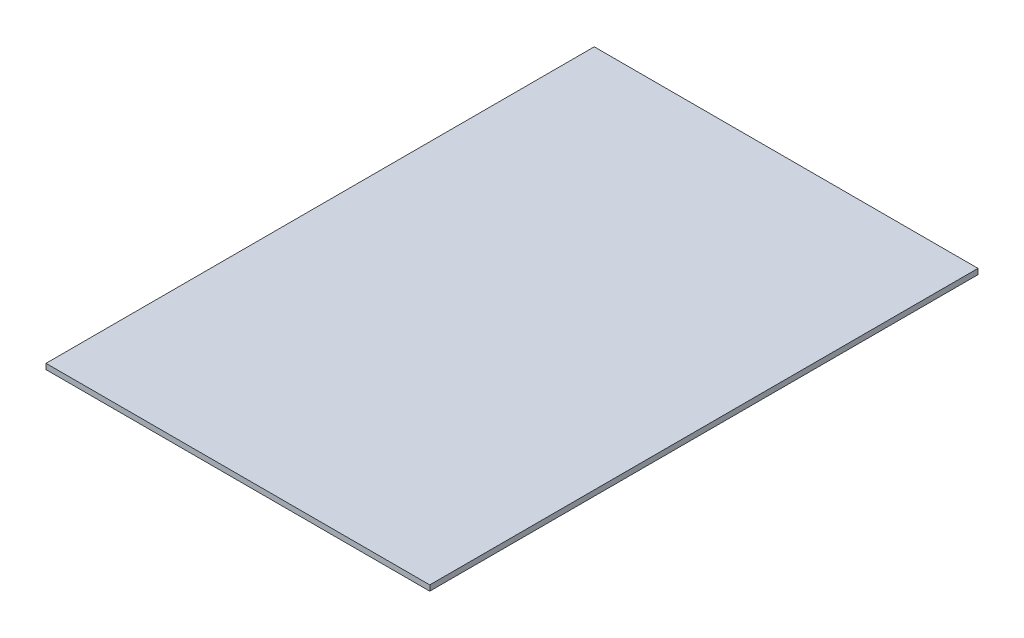
ISO-10303-21;
HEADER;
FILE_DESCRIPTION(('STEP AP214'),'2;1');
FILE_NAME('part.step','',(''),(''),'','','');
FILE_SCHEMA(('AUTOMOTIVE_DESIGN { 1 0 10303 214 1 1 1 1 }'));
ENDSEC;
DATA;
#1=APPLICATION_CONTEXT('core data for automotive mechanical design processes');
#2=APPLICATION_PROTOCOL_DEFINITION('international standard','automotive_design',2000,#1);
#3=PRODUCT_CONTEXT('',#1,'mechanical');
#4=PRODUCT('Part','Part','',(#3));
#5=PRODUCT_RELATED_PRODUCT_CATEGORY('part','',(#4));
#6=PRODUCT_DEFINITION_FORMATION('','',#4);
#7=PRODUCT_DEFINITION_CONTEXT('part definition',#1,'design');
#8=PRODUCT_DEFINITION('design','',#6,#7);
#9=PRODUCT_DEFINITION_SHAPE('','',#8);
#10=(LENGTH_UNIT() NAMED_UNIT(*) SI_UNIT(.MILLI.,.METRE.));
#11=(NAMED_UNIT(*) PLANE_ANGLE_UNIT() SI_UNIT($,.RADIAN.));
#12=(NAMED_UNIT(*) SI_UNIT($,.STERADIAN.) SOLID_ANGLE_UNIT());
#13=UNCERTAINTY_MEASURE_WITH_UNIT(LENGTH_MEASURE(1.E-05),#10,'distance_accuracy_value','');
#14=(GEOMETRIC_REPRESENTATION_CONTEXT(3) GLOBAL_UNCERTAINTY_ASSIGNED_CONTEXT((#13)) GLOBAL_UNIT_ASSIGNED_CONTEXT((#10,
#11,#12)) REPRESENTATION_CONTEXT('',''));
#15=CARTESIAN_POINT('',(0.,0.,0.));
#16=DIRECTION('',(0.,0.,1.));
#17=DIRECTION('',(1.,0.,0.));
#18=AXIS2_PLACEMENT_3D('',#15,#16,#17);
#19=CARTESIAN_POINT('',(0.,0.,0.));
#20=DIRECTION('',(0.,1.,0.));
#21=DIRECTION('',(0.,0.,1.));
#22=AXIS2_PLACEMENT_3D('',#19,#20,#21);
#23=PLANE('',#22);
#24=DIRECTION('',(1.,0.,0.));
#25=VECTOR('',#24,1.);
#26=CARTESIAN_POINT('',(375.,0.,-1875.));
#27=LINE('',#26,#25);
#28=CARTESIAN_POINT('',(-375.,0.,-1875.));
#29=VERTEX_POINT('',#28);
#30=CARTESIAN_POINT('',(375.,0.,-1875.));
#31=VERTEX_POINT('',#30);
#32=EDGE_CURVE('E177',#29,#31,#27,.T.);
#33=ORIENTED_EDGE('',*,*,#32,.F.);
#34=DIRECTION('',(0.,0.,-1.));
#35=VECTOR('',#34,1.);
#36=CARTESIAN_POINT('',(-375.,0.,-1875.));
#37=LINE('',#36,#35);
#38=CARTESIAN_POINT('',(-375.,0.,-1125.));
#39=VERTEX_POINT('',#38);
#40=EDGE_CURVE('E49',#39,#29,#37,.T.);
#41=ORIENTED_EDGE('',*,*,#40,.F.);
#42=DIRECTION('',(-1.,0.,0.));
#43=VECTOR('',#42,1.);
#44=CARTESIAN_POINT('',(375.,0.,-1125.));
#45=LINE('',#44,#43);
#46=CARTESIAN_POINT('',(375.,0.,-1125.));
#47=VERTEX_POINT('',#46);
#48=EDGE_CURVE('E168',#47,#39,#45,.T.);
#49=ORIENTED_EDGE('',*,*,#48,.F.);
#50=DIRECTION('',(0.,0.,1.));
#51=VECTOR('',#50,1.);
#52=CARTESIAN_POINT('',(375.,0.,-1875.));
#53=LINE('',#52,#51);
#54=EDGE_CURVE('E171',#31,#47,#53,.T.);
#55=ORIENTED_EDGE('',*,*,#54,.F.);
#56=EDGE_LOOP('',(#33,#41,#49,#55));
#57=FACE_BOUND('',#56,.T.);
#58=DIRECTION('',(0.,0.,1.));
#59=VECTOR('',#58,1.);
#60=CARTESIAN_POINT('',(487.5,0.,0.));
#61=LINE('',#60,#59);
#62=CARTESIAN_POINT('',(487.5,0.,1125.));
#63=VERTEX_POINT('',#62);
#64=CARTESIAN_POINT('',(487.5,0.,1875.));
#65=VERTEX_POINT('',#64);
#66=EDGE_CURVE('E183',#63,#65,#61,.T.);
#67=ORIENTED_EDGE('',*,*,#66,.T.);
#68=DIRECTION('',(-1.,0.,0.));
#69=VECTOR('',#68,1.);
#70=CARTESIAN_POINT('',(0.,0.,1875.));
#71=LINE('',#70,#69);
#72=CARTESIAN_POINT('',(1237.5,0.,1875.));
#73=VERTEX_POINT('',#72);
#74=EDGE_CURVE('E220',#73,#65,#71,.T.);
#75=ORIENTED_EDGE('',*,*,#74,.F.);
#76=DIRECTION('',(0.,0.,1.));
#77=VECTOR('',#76,1.);
#78=CARTESIAN_POINT('',(1237.5,0.,-3.66373598126302E-13));
#79=LINE('',#78,#77);
#80=CARTESIAN_POINT('',(1237.5,0.,1125.));
#81=VERTEX_POINT('',#80);
#82=EDGE_CURVE('E234',#81,#73,#79,.T.);
#83=ORIENTED_EDGE('',*,*,#82,.F.);
#84=DIRECTION('',(-1.,0.,0.));
#85=VECTOR('',#84,1.);
#86=CARTESIAN_POINT('',(-3.33066907387547E-13,0.,1125.));
#87=LINE('',#86,#85);
#88=EDGE_CURVE('E231',#81,#63,#87,.T.);
#89=ORIENTED_EDGE('',*,*,#88,.T.);
#90=EDGE_LOOP('',(#67,#75,#83,#89));
#91=FACE_BOUND('',#90,.T.);
#92=DIRECTION('',(0.,0.,1.));
#93=VECTOR('',#92,1.);
#94=CARTESIAN_POINT('',(-1750.,0.,2500.));
#95=LINE('',#94,#93);
#96=CARTESIAN_POINT('',(-1750.,0.,-2500.));
#97=VERTEX_POINT('',#96);
#98=CARTESIAN_POINT('',(-1750.,0.,2500.));
#99=VERTEX_POINT('',#98);
#100=EDGE_CURVE('E211',#97,#99,#95,.T.);
#101=ORIENTED_EDGE('',*,*,#100,.F.);
#102=DIRECTION('',(-1.,0.,0.));
#103=VECTOR('',#102,1.);
#104=CARTESIAN_POINT('',(1750.,0.,-2500.));
#105=LINE('',#104,#103);
#106=CARTESIAN_POINT('',(1750.,0.,-2500.));
#107=VERTEX_POINT('',#106);
#108=EDGE_CURVE('E250',#107,#97,#105,.T.);
#109=ORIENTED_EDGE('',*,*,#108,.F.);
#110=DIRECTION('',(0.,0.,-1.));
#111=VECTOR('',#110,1.);
#112=CARTESIAN_POINT('',(1750.,0.,2500.));
#113=LINE('',#112,#111);
#114=CARTESIAN_POINT('',(1750.,0.,2500.));
#115=VERTEX_POINT('',#114);
#116=EDGE_CURVE('E261',#115,#107,#113,.T.);
#117=ORIENTED_EDGE('',*,*,#116,.F.);
#118=DIRECTION('',(1.,0.,0.));
#119=VECTOR('',#118,1.);
#120=CARTESIAN_POINT('',(1750.,0.,2500.));
#121=LINE('',#120,#119);
#122=EDGE_CURVE('E259',#99,#115,#121,.T.);
#123=ORIENTED_EDGE('',*,*,#122,.F.);
#124=EDGE_LOOP('',(#101,#109,#117,#123));
#125=FACE_BOUND('',#124,.T.);
#126=DIRECTION('',(0.,0.,1.));
#127=VECTOR('',#126,1.);
#128=CARTESIAN_POINT('',(-1237.5,0.,0.));
#129=LINE('',#128,#127);
#130=CARTESIAN_POINT('',(-1237.5,0.,1125.));
#131=VERTEX_POINT('',#130);
#132=CARTESIAN_POINT('',(-1237.5,0.,1875.));
#133=VERTEX_POINT('',#132);
#134=EDGE_CURVE('E57',#131,#133,#129,.T.);
#135=ORIENTED_EDGE('',*,*,#134,.T.);
#136=DIRECTION('',(-1.,0.,0.));
#137=VECTOR('',#136,1.);
#138=CARTESIAN_POINT('',(0.,0.,1875.));
#139=LINE('',#138,#137);
#140=CARTESIAN_POINT('',(-487.5,0.,1875.));
#141=VERTEX_POINT('',#140);
#142=EDGE_CURVE('E190',#141,#133,#139,.T.);
#143=ORIENTED_EDGE('',*,*,#142,.F.);
#144=DIRECTION('',(0.,0.,1.));
#145=VECTOR('',#144,1.);
#146=CARTESIAN_POINT('',(-487.5,0.,0.));
#147=LINE('',#146,#145);
#148=CARTESIAN_POINT('',(-487.5,0.,1125.));
#149=VERTEX_POINT('',#148);
#150=EDGE_CURVE('E204',#149,#141,#147,.T.);
#151=ORIENTED_EDGE('',*,*,#150,.F.);
#152=DIRECTION('',(-1.,0.,0.));
#153=VECTOR('',#152,1.);
#154=CARTESIAN_POINT('',(-3.33066907387547E-13,0.,1125.));
#155=LINE('',#154,#153);
#156=EDGE_CURVE('E200',#149,#131,#155,.T.);
#157=ORIENTED_EDGE('',*,*,#156,.T.);
#158=EDGE_LOOP('',(#135,#143,#151,#157));
#159=FACE_BOUND('',#158,.T.);
#160=ADVANCED_FACE('F34',(#57,#91,#125,#159),#23,.F.);
#161=CARTESIAN_POINT('',(-1750.,50.,2500.));
#162=DIRECTION('',(1.,0.,0.));
#163=DIRECTION('',(0.,0.,-1.));
#164=AXIS2_PLACEMENT_3D('',#161,#162,#163);
#165=PLANE('',#164);
#166=ORIENTED_EDGE('',*,*,#100,.T.);
#167=DIRECTION('',(0.,-1.,0.));
#168=VECTOR('',#167,1.);
#169=CARTESIAN_POINT('',(-1750.,50.,2500.));
#170=LINE('',#169,#168);
#171=CARTESIAN_POINT('',(-1750.,50.,2500.));
#172=VERTEX_POINT('',#171);
#173=EDGE_CURVE('E12',#172,#99,#170,.T.);
#174=ORIENTED_EDGE('',*,*,#173,.F.);
#175=DIRECTION('',(0.,0.,1.));
#176=VECTOR('',#175,1.);
#177=CARTESIAN_POINT('',(-1750.,50.,2500.));
#178=LINE('',#177,#176);
#179=CARTESIAN_POINT('',(-1750.,50.,-2500.));
#180=VERTEX_POINT('',#179);
#181=EDGE_CURVE('E246',#180,#172,#178,.T.);
#182=ORIENTED_EDGE('',*,*,#181,.F.);
#183=DIRECTION('',(0.,-1.,0.));
#184=VECTOR('',#183,1.);
#185=CARTESIAN_POINT('',(-1750.,50.,-2500.));
#186=LINE('',#185,#184);
#187=EDGE_CURVE('E256',#180,#97,#186,.T.);
#188=ORIENTED_EDGE('',*,*,#187,.T.);
#189=EDGE_LOOP('',(#166,#174,#182,#188));
#190=FACE_BOUND('',#189,.T.);
#191=ADVANCED_FACE('F36',(#190),#165,.F.);
#192=CARTESIAN_POINT('',(1750.,50.,2500.));
#193=DIRECTION('',(0.,0.,-1.));
#194=DIRECTION('',(-1.,0.,0.));
#195=AXIS2_PLACEMENT_3D('',#192,#193,#194);
#196=PLANE('',#195);
#197=ORIENTED_EDGE('',*,*,#122,.T.);
#198=DIRECTION('',(0.,-1.,0.));
#199=VECTOR('',#198,1.);
#200=CARTESIAN_POINT('',(1750.,50.,2500.));
#201=LINE('',#200,#199);
#202=CARTESIAN_POINT('',(1750.,50.,2500.));
#203=VERTEX_POINT('',#202);
#204=EDGE_CURVE('E42',#203,#115,#201,.T.);
#205=ORIENTED_EDGE('',*,*,#204,.F.);
#206=DIRECTION('',(1.,0.,0.));
#207=VECTOR('',#206,1.);
#208=CARTESIAN_POINT('',(1750.,50.,2500.));
#209=LINE('',#208,#207);
#210=EDGE_CURVE('E249',#172,#203,#209,.T.);
#211=ORIENTED_EDGE('',*,*,#210,.F.);
#212=ORIENTED_EDGE('',*,*,#173,.T.);
#213=EDGE_LOOP('',(#197,#205,#211,#212));
#214=FACE_BOUND('',#213,.T.);
#215=ADVANCED_FACE('F289',(#214),#196,.F.);
#216=CARTESIAN_POINT('',(1750.,50.,2500.));
#217=DIRECTION('',(-1.,0.,0.));
#218=DIRECTION('',(0.,0.,1.));
#219=AXIS2_PLACEMENT_3D('',#216,#217,#218);
#220=PLANE('',#219);
#221=ORIENTED_EDGE('',*,*,#116,.T.);
#222=DIRECTION('',(0.,-1.,0.));
#223=VECTOR('',#222,1.);
#224=CARTESIAN_POINT('',(1750.,50.,-2500.));
#225=LINE('',#224,#223);
#226=CARTESIAN_POINT('',(1750.,50.,-2500.));
#227=VERTEX_POINT('',#226);
#228=EDGE_CURVE('E266',#227,#107,#225,.T.);
#229=ORIENTED_EDGE('',*,*,#228,.F.);
#230=DIRECTION('',(0.,0.,-1.));
#231=VECTOR('',#230,1.);
#232=CARTESIAN_POINT('',(1750.,50.,2500.));
#233=LINE('',#232,#231);
#234=EDGE_CURVE('E252',#203,#227,#233,.T.);
#235=ORIENTED_EDGE('',*,*,#234,.F.);
#236=ORIENTED_EDGE('',*,*,#204,.T.);
#237=EDGE_LOOP('',(#221,#229,#235,#236));
#238=FACE_BOUND('',#237,.T.);
#239=ADVANCED_FACE('F273',(#238),#220,.F.);
#240=CARTESIAN_POINT('',(1750.,50.,-2500.));
#241=DIRECTION('',(0.,0.,1.));
#242=DIRECTION('',(1.,0.,0.));
#243=AXIS2_PLACEMENT_3D('',#240,#241,#242);
#244=PLANE('',#243);
#245=ORIENTED_EDGE('',*,*,#108,.T.);
#246=ORIENTED_EDGE('',*,*,#187,.F.);
#247=DIRECTION('',(-1.,0.,0.));
#248=VECTOR('',#247,1.);
#249=CARTESIAN_POINT('',(1750.,50.,-2500.));
#250=LINE('',#249,#248);
#251=EDGE_CURVE('E254',#227,#180,#250,.T.);
#252=ORIENTED_EDGE('',*,*,#251,.F.);
#253=ORIENTED_EDGE('',*,*,#228,.T.);
#254=EDGE_LOOP('',(#245,#246,#252,#253));
#255=FACE_BOUND('',#254,.T.);
#256=ADVANCED_FACE('F282',(#255),#244,.F.);
#257=CARTESIAN_POINT('',(0.,50.,0.));
#258=DIRECTION('',(0.,1.,0.));
#259=DIRECTION('',(0.,0.,1.));
#260=AXIS2_PLACEMENT_3D('',#257,#258,#259);
#261=PLANE('',#260);
#262=ORIENTED_EDGE('',*,*,#181,.T.);
#263=ORIENTED_EDGE('',*,*,#210,.T.);
#264=ORIENTED_EDGE('',*,*,#234,.T.);
#265=ORIENTED_EDGE('',*,*,#251,.T.);
#266=EDGE_LOOP('',(#262,#263,#264,#265));
#267=FACE_BOUND('',#266,.T.);
#268=ADVANCED_FACE('F288',(#267),#261,.T.);
#269=CARTESIAN_POINT('',(487.5,10.,0.));
#270=DIRECTION('',(1.,0.,0.));
#271=DIRECTION('',(0.,0.,-1.));
#272=AXIS2_PLACEMENT_3D('',#269,#270,#271);
#273=PLANE('',#272);
#274=ORIENTED_EDGE('',*,*,#66,.F.);
#275=DIRECTION('',(0.,-1.,0.));
#276=VECTOR('',#275,1.);
#277=CARTESIAN_POINT('',(487.5,10.,1125.));
#278=LINE('',#277,#276);
#279=CARTESIAN_POINT('',(487.5,10.,1125.));
#280=VERTEX_POINT('',#279);
#281=EDGE_CURVE('E228',#280,#63,#278,.T.);
#282=ORIENTED_EDGE('',*,*,#281,.F.);
#283=DIRECTION('',(0.,0.,1.));
#284=VECTOR('',#283,1.);
#285=CARTESIAN_POINT('',(487.5,10.,0.));
#286=LINE('',#285,#284);
#287=CARTESIAN_POINT('',(487.5,10.,1875.));
#288=VERTEX_POINT('',#287);
#289=EDGE_CURVE('E217',#280,#288,#286,.T.);
#290=ORIENTED_EDGE('',*,*,#289,.T.);
#291=DIRECTION('',(0.,-1.,0.));
#292=VECTOR('',#291,1.);
#293=CARTESIAN_POINT('',(487.5,10.,1875.));
#294=LINE('',#293,#292);
#295=EDGE_CURVE('E201',#288,#65,#294,.T.);
#296=ORIENTED_EDGE('',*,*,#295,.T.);
#297=EDGE_LOOP('',(#274,#282,#290,#296));
#298=FACE_BOUND('',#297,.T.);
#299=ADVANCED_FACE('F309',(#298),#273,.T.);
#300=CARTESIAN_POINT('',(0.,10.,1875.));
#301=DIRECTION('',(0.,0.,1.));
#302=DIRECTION('',(1.,0.,0.));
#303=AXIS2_PLACEMENT_3D('',#300,#301,#302);
#304=PLANE('',#303);
#305=ORIENTED_EDGE('',*,*,#74,.T.);
#306=ORIENTED_EDGE('',*,*,#295,.F.);
#307=DIRECTION('',(-1.,0.,0.));
#308=VECTOR('',#307,1.);
#309=CARTESIAN_POINT('',(0.,10.,1875.));
#310=LINE('',#309,#308);
#311=CARTESIAN_POINT('',(1237.5,10.,1875.));
#312=VERTEX_POINT('',#311);
#313=EDGE_CURVE('E225',#312,#288,#310,.T.);
#314=ORIENTED_EDGE('',*,*,#313,.F.);
#315=DIRECTION('',(0.,-1.,0.));
#316=VECTOR('',#315,1.);
#317=CARTESIAN_POINT('',(1237.5,10.,1875.));
#318=LINE('',#317,#316);
#319=EDGE_CURVE('E240',#312,#73,#318,.T.);
#320=ORIENTED_EDGE('',*,*,#319,.T.);
#321=EDGE_LOOP('',(#305,#306,#314,#320));
#322=FACE_BOUND('',#321,.T.);
#323=ADVANCED_FACE('F313',(#322),#304,.F.);
#324=CARTESIAN_POINT('',(1237.5,10.,-3.66373598126302E-13));
#325=DIRECTION('',(1.,0.,0.));
#326=DIRECTION('',(0.,0.,-1.));
#327=AXIS2_PLACEMENT_3D('',#324,#325,#326);
#328=PLANE('',#327);
#329=ORIENTED_EDGE('',*,*,#82,.T.);
#330=ORIENTED_EDGE('',*,*,#319,.F.);
#331=DIRECTION('',(0.,0.,1.));
#332=VECTOR('',#331,1.);
#333=CARTESIAN_POINT('',(1237.5,10.,-3.66373598126302E-13));
#334=LINE('',#333,#332);
#335=CARTESIAN_POINT('',(1237.5,10.,1125.));
#336=VERTEX_POINT('',#335);
#337=EDGE_CURVE('E222',#336,#312,#334,.T.);
#338=ORIENTED_EDGE('',*,*,#337,.F.);
#339=DIRECTION('',(0.,-1.,0.));
#340=VECTOR('',#339,1.);
#341=CARTESIAN_POINT('',(1237.5,10.,1125.));
#342=LINE('',#341,#340);
#343=EDGE_CURVE('E242',#336,#81,#342,.T.);
#344=ORIENTED_EDGE('',*,*,#343,.T.);
#345=EDGE_LOOP('',(#329,#330,#338,#344));
#346=FACE_BOUND('',#345,.T.);
#347=ADVANCED_FACE('F318',(#346),#328,.F.);
#348=CARTESIAN_POINT('',(-3.33066907387547E-13,10.,1125.));
#349=DIRECTION('',(0.,0.,1.));
#350=DIRECTION('',(1.,0.,0.));
#351=AXIS2_PLACEMENT_3D('',#348,#349,#350);
#352=PLANE('',#351);
#353=ORIENTED_EDGE('',*,*,#88,.F.);
#354=ORIENTED_EDGE('',*,*,#343,.F.);
#355=DIRECTION('',(-1.,0.,0.));
#356=VECTOR('',#355,1.);
#357=CARTESIAN_POINT('',(-3.33066907387547E-13,10.,1125.));
#358=LINE('',#357,#356);
#359=EDGE_CURVE('E219',#336,#280,#358,.T.);
#360=ORIENTED_EDGE('',*,*,#359,.T.);
#361=ORIENTED_EDGE('',*,*,#281,.T.);
#362=EDGE_LOOP('',(#353,#354,#360,#361));
#363=FACE_BOUND('',#362,.T.);
#364=ADVANCED_FACE('F322',(#363),#352,.T.);
#365=CARTESIAN_POINT('',(0.,10.,0.));
#366=DIRECTION('',(0.,-1.,0.));
#367=DIRECTION('',(0.,0.,-1.));
#368=AXIS2_PLACEMENT_3D('',#365,#366,#367);
#369=PLANE('',#368);
#370=ORIENTED_EDGE('',*,*,#289,.F.);
#371=ORIENTED_EDGE('',*,*,#359,.F.);
#372=ORIENTED_EDGE('',*,*,#337,.T.);
#373=ORIENTED_EDGE('',*,*,#313,.T.);
#374=EDGE_LOOP('',(#370,#371,#372,#373));
#375=FACE_BOUND('',#374,.T.);
#376=ADVANCED_FACE('F325',(#375),#369,.T.);
#377=CARTESIAN_POINT('',(-1237.5,10.,0.));
#378=DIRECTION('',(1.,0.,0.));
#379=DIRECTION('',(0.,0.,-1.));
#380=AXIS2_PLACEMENT_3D('',#377,#378,#379);
#381=PLANE('',#380);
#382=ORIENTED_EDGE('',*,*,#134,.F.);
#383=DIRECTION('',(0.,-1.,0.));
#384=VECTOR('',#383,1.);
#385=CARTESIAN_POINT('',(-1237.5,10.,1125.));
#386=LINE('',#385,#384);
#387=CARTESIAN_POINT('',(-1237.5,10.,1125.));
#388=VERTEX_POINT('',#387);
#389=EDGE_CURVE('E198',#388,#131,#386,.T.);
#390=ORIENTED_EDGE('',*,*,#389,.F.);
#391=DIRECTION('',(0.,0.,1.));
#392=VECTOR('',#391,1.);
#393=CARTESIAN_POINT('',(-1237.5,10.,0.));
#394=LINE('',#393,#392);
#395=CARTESIAN_POINT('',(-1237.5,10.,1875.));
#396=VERTEX_POINT('',#395);
#397=EDGE_CURVE('E187',#388,#396,#394,.T.);
#398=ORIENTED_EDGE('',*,*,#397,.T.);
#399=DIRECTION('',(0.,-1.,0.));
#400=VECTOR('',#399,1.);
#401=CARTESIAN_POINT('',(-1237.5,10.,1875.));
#402=LINE('',#401,#400);
#403=EDGE_CURVE('E209',#396,#133,#402,.T.);
#404=ORIENTED_EDGE('',*,*,#403,.T.);
#405=EDGE_LOOP('',(#382,#390,#398,#404));
#406=FACE_BOUND('',#405,.T.);
#407=ADVANCED_FACE('F332',(#406),#381,.T.);
#408=CARTESIAN_POINT('',(0.,10.,1875.));
#409=DIRECTION('',(0.,0.,1.));
#410=DIRECTION('',(1.,0.,0.));
#411=AXIS2_PLACEMENT_3D('',#408,#409,#410);
#412=PLANE('',#411);
#413=ORIENTED_EDGE('',*,*,#142,.T.);
#414=ORIENTED_EDGE('',*,*,#403,.F.);
#415=DIRECTION('',(-1.,0.,0.));
#416=VECTOR('',#415,1.);
#417=CARTESIAN_POINT('',(0.,10.,1875.));
#418=LINE('',#417,#416);
#419=CARTESIAN_POINT('',(-487.5,10.,1875.));
#420=VERTEX_POINT('',#419);
#421=EDGE_CURVE('E195',#420,#396,#418,.T.);
#422=ORIENTED_EDGE('',*,*,#421,.F.);
#423=DIRECTION('',(0.,-1.,0.));
#424=VECTOR('',#423,1.);
#425=CARTESIAN_POINT('',(-487.5,10.,1875.));
#426=LINE('',#425,#424);
#427=EDGE_CURVE('E212',#420,#141,#426,.T.);
#428=ORIENTED_EDGE('',*,*,#427,.T.);
#429=EDGE_LOOP('',(#413,#414,#422,#428));
#430=FACE_BOUND('',#429,.T.);
#431=ADVANCED_FACE('F336',(#430),#412,.F.);
#432=CARTESIAN_POINT('',(-487.5,10.,0.));
#433=DIRECTION('',(1.,0.,0.));
#434=DIRECTION('',(0.,0.,-1.));
#435=AXIS2_PLACEMENT_3D('',#432,#433,#434);
#436=PLANE('',#435);
#437=ORIENTED_EDGE('',*,*,#150,.T.);
#438=ORIENTED_EDGE('',*,*,#427,.F.);
#439=DIRECTION('',(0.,0.,1.));
#440=VECTOR('',#439,1.);
#441=CARTESIAN_POINT('',(-487.5,10.,0.));
#442=LINE('',#441,#440);
#443=CARTESIAN_POINT('',(-487.5,10.,1125.));
#444=VERTEX_POINT('',#443);
#445=EDGE_CURVE('E192',#444,#420,#442,.T.);
#446=ORIENTED_EDGE('',*,*,#445,.F.);
#447=DIRECTION('',(0.,-1.,0.));
#448=VECTOR('',#447,1.);
#449=CARTESIAN_POINT('',(-487.5,10.,1125.));
#450=LINE('',#449,#448);
#451=EDGE_CURVE('E214',#444,#149,#450,.T.);
#452=ORIENTED_EDGE('',*,*,#451,.T.);
#453=EDGE_LOOP('',(#437,#438,#446,#452));
#454=FACE_BOUND('',#453,.T.);
#455=ADVANCED_FACE('F341',(#454),#436,.F.);
#456=CARTESIAN_POINT('',(-3.33066907387547E-13,10.,1125.));
#457=DIRECTION('',(0.,0.,1.));
#458=DIRECTION('',(1.,0.,0.));
#459=AXIS2_PLACEMENT_3D('',#456,#457,#458);
#460=PLANE('',#459);
#461=ORIENTED_EDGE('',*,*,#156,.F.);
#462=ORIENTED_EDGE('',*,*,#451,.F.);
#463=DIRECTION('',(-1.,0.,0.));
#464=VECTOR('',#463,1.);
#465=CARTESIAN_POINT('',(-3.33066907387547E-13,10.,1125.));
#466=LINE('',#465,#464);
#467=EDGE_CURVE('E189',#444,#388,#466,.T.);
#468=ORIENTED_EDGE('',*,*,#467,.T.);
#469=ORIENTED_EDGE('',*,*,#389,.T.);
#470=EDGE_LOOP('',(#461,#462,#468,#469));
#471=FACE_BOUND('',#470,.T.);
#472=ADVANCED_FACE('F337',(#471),#460,.T.);
#473=CARTESIAN_POINT('',(0.,10.,0.));
#474=DIRECTION('',(0.,-1.,0.));
#475=DIRECTION('',(0.,0.,-1.));
#476=AXIS2_PLACEMENT_3D('',#473,#474,#475);
#477=PLANE('',#476);
#478=ORIENTED_EDGE('',*,*,#397,.F.);
#479=ORIENTED_EDGE('',*,*,#467,.F.);
#480=ORIENTED_EDGE('',*,*,#445,.T.);
#481=ORIENTED_EDGE('',*,*,#421,.T.);
#482=EDGE_LOOP('',(#478,#479,#480,#481));
#483=FACE_BOUND('',#482,.T.);
#484=ADVANCED_FACE('F340',(#483),#477,.T.);
#485=CARTESIAN_POINT('',(-375.,10.,-1875.));
#486=DIRECTION('',(-1.,0.,0.));
#487=DIRECTION('',(0.,0.,1.));
#488=AXIS2_PLACEMENT_3D('',#485,#486,#487);
#489=PLANE('',#488);
#490=ORIENTED_EDGE('',*,*,#40,.T.);
#491=DIRECTION('',(0.,-1.,0.));
#492=VECTOR('',#491,1.);
#493=CARTESIAN_POINT('',(-375.,10.,-1875.));
#494=LINE('',#493,#492);
#495=CARTESIAN_POINT('',(-375.,10.,-1875.));
#496=VERTEX_POINT('',#495);
#497=EDGE_CURVE('E146',#496,#29,#494,.T.);
#498=ORIENTED_EDGE('',*,*,#497,.F.);
#499=DIRECTION('',(0.,0.,-1.));
#500=VECTOR('',#499,1.);
#501=CARTESIAN_POINT('',(-375.,10.,-1875.));
#502=LINE('',#501,#500);
#503=CARTESIAN_POINT('',(-375.,10.,-1125.));
#504=VERTEX_POINT('',#503);
#505=EDGE_CURVE('E150',#504,#496,#502,.T.);
#506=ORIENTED_EDGE('',*,*,#505,.F.);
#507=DIRECTION('',(0.,-1.,0.));
#508=VECTOR('',#507,1.);
#509=CARTESIAN_POINT('',(-375.,10.,-1125.));
#510=LINE('',#509,#508);
#511=EDGE_CURVE('E181',#504,#39,#510,.T.);
#512=ORIENTED_EDGE('',*,*,#511,.T.);
#513=EDGE_LOOP('',(#490,#498,#506,#512));
#514=FACE_BOUND('',#513,.T.);
#515=ADVANCED_FACE('F148',(#514),#489,.F.);
#516=CARTESIAN_POINT('',(375.,10.,-1125.));
#517=DIRECTION('',(0.,0.,1.));
#518=DIRECTION('',(1.,0.,0.));
#519=AXIS2_PLACEMENT_3D('',#516,#517,#518);
#520=PLANE('',#519);
#521=ORIENTED_EDGE('',*,*,#48,.T.);
#522=ORIENTED_EDGE('',*,*,#511,.F.);
#523=DIRECTION('',(-1.,0.,0.));
#524=VECTOR('',#523,1.);
#525=CARTESIAN_POINT('',(375.,10.,-1125.));
#526=LINE('',#525,#524);
#527=CARTESIAN_POINT('',(375.,10.,-1125.));
#528=VERTEX_POINT('',#527);
#529=EDGE_CURVE('E156',#528,#504,#526,.T.);
#530=ORIENTED_EDGE('',*,*,#529,.F.);
#531=DIRECTION('',(0.,-1.,0.));
#532=VECTOR('',#531,1.);
#533=CARTESIAN_POINT('',(375.,10.,-1125.));
#534=LINE('',#533,#532);
#535=EDGE_CURVE('E184',#528,#47,#534,.T.);
#536=ORIENTED_EDGE('',*,*,#535,.T.);
#537=EDGE_LOOP('',(#521,#522,#530,#536));
#538=FACE_BOUND('',#537,.T.);
#539=ADVANCED_FACE('F354',(#538),#520,.F.);
#540=CARTESIAN_POINT('',(375.,10.,-1875.));
#541=DIRECTION('',(1.,0.,0.));
#542=DIRECTION('',(0.,0.,-1.));
#543=AXIS2_PLACEMENT_3D('',#540,#541,#542);
#544=PLANE('',#543);
#545=ORIENTED_EDGE('',*,*,#54,.T.);
#546=ORIENTED_EDGE('',*,*,#535,.F.);
#547=DIRECTION('',(0.,0.,1.));
#548=VECTOR('',#547,1.);
#549=CARTESIAN_POINT('',(375.,10.,-1875.));
#550=LINE('',#549,#548);
#551=CARTESIAN_POINT('',(375.,10.,-1875.));
#552=VERTEX_POINT('',#551);
#553=EDGE_CURVE('E164',#552,#528,#550,.T.);
#554=ORIENTED_EDGE('',*,*,#553,.F.);
#555=DIRECTION('',(0.,-1.,0.));
#556=VECTOR('',#555,1.);
#557=CARTESIAN_POINT('',(375.,10.,-1875.));
#558=LINE('',#557,#556);
#559=EDGE_CURVE('E155',#552,#31,#558,.T.);
#560=ORIENTED_EDGE('',*,*,#559,.T.);
#561=EDGE_LOOP('',(#545,#546,#554,#560));
#562=FACE_BOUND('',#561,.T.);
#563=ADVANCED_FACE('F357',(#562),#544,.F.);
#564=CARTESIAN_POINT('',(375.,10.,-1875.));
#565=DIRECTION('',(0.,0.,-1.));
#566=DIRECTION('',(-1.,0.,0.));
#567=AXIS2_PLACEMENT_3D('',#564,#565,#566);
#568=PLANE('',#567);
#569=ORIENTED_EDGE('',*,*,#32,.T.);
#570=ORIENTED_EDGE('',*,*,#559,.F.);
#571=DIRECTION('',(1.,0.,0.));
#572=VECTOR('',#571,1.);
#573=CARTESIAN_POINT('',(375.,10.,-1875.));
#574=LINE('',#573,#572);
#575=EDGE_CURVE('E159',#496,#552,#574,.T.);
#576=ORIENTED_EDGE('',*,*,#575,.F.);
#577=ORIENTED_EDGE('',*,*,#497,.T.);
#578=EDGE_LOOP('',(#569,#570,#576,#577));
#579=FACE_BOUND('',#578,.T.);
#580=ADVANCED_FACE('F160',(#579),#568,.F.);
#581=CARTESIAN_POINT('',(0.,10.,0.));
#582=DIRECTION('',(0.,-1.,0.));
#583=DIRECTION('',(0.,0.,-1.));
#584=AXIS2_PLACEMENT_3D('',#581,#582,#583);
#585=PLANE('',#584);
#586=ORIENTED_EDGE('',*,*,#505,.T.);
#587=ORIENTED_EDGE('',*,*,#575,.T.);
#588=ORIENTED_EDGE('',*,*,#553,.T.);
#589=ORIENTED_EDGE('',*,*,#529,.T.);
#590=EDGE_LOOP('',(#586,#587,#588,#589));
#591=FACE_BOUND('',#590,.T.);
#592=ADVANCED_FACE('F166',(#591),#585,.T.);
#593=CLOSED_SHELL('',(#160,#191,#215,#239,#256,#268,#299,#323,#347,#364,#376,#407,#431,#455,
#472,#484,#515,#539,#563,#580,#592));
#594=MANIFOLD_SOLID_BREP('B2',#593);
#595=ADVANCED_BREP_SHAPE_REPRESENTATION('',(#18,#594),#14);
#596=SHAPE_DEFINITION_REPRESENTATION(#9,#595);
ENDSEC;
END-ISO-10303-21;
